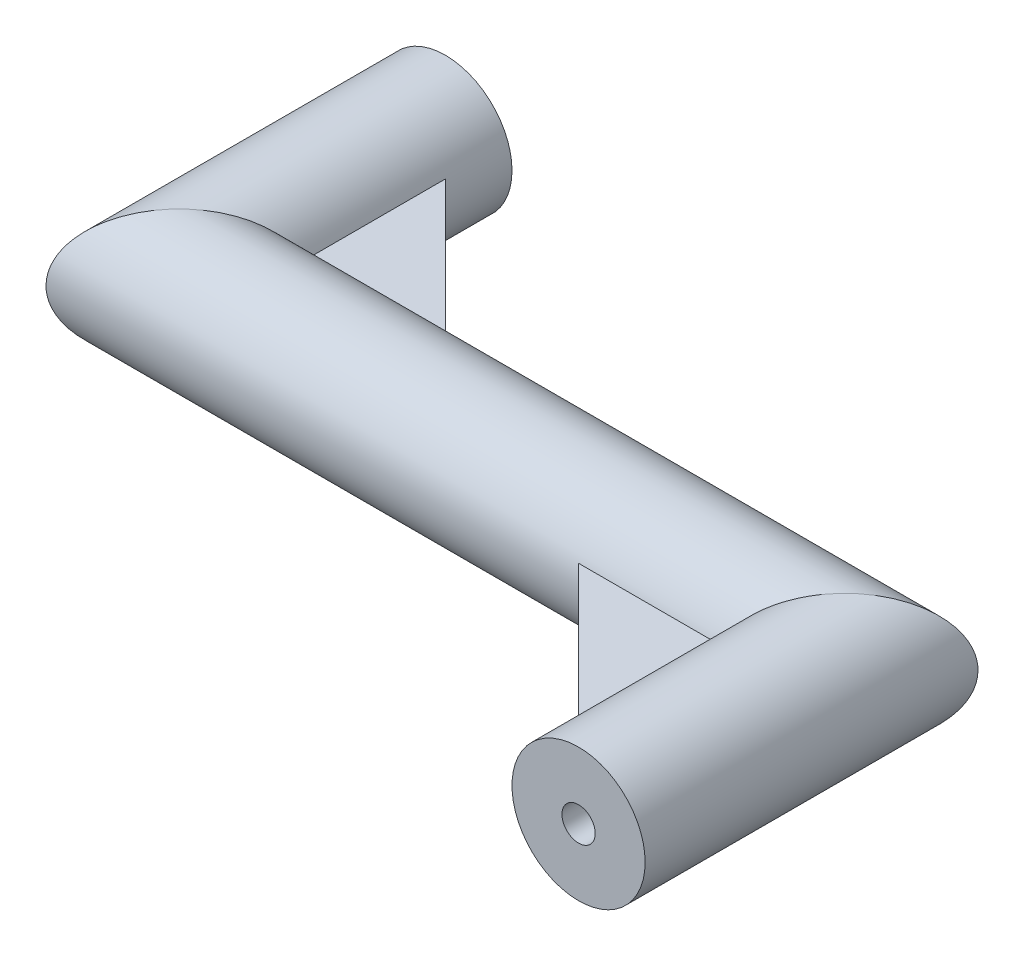
ISO-10303-21;
HEADER;
FILE_DESCRIPTION(('STEP AP214'),'2;1');
FILE_NAME('part.step','',(''),(''),'','','');
FILE_SCHEMA(('AUTOMOTIVE_DESIGN { 1 0 10303 214 1 1 1 1 }'));
ENDSEC;
DATA;
#1=APPLICATION_CONTEXT('core data for automotive mechanical design processes');
#2=APPLICATION_PROTOCOL_DEFINITION('international standard','automotive_design',2000,#1);
#3=PRODUCT_CONTEXT('',#1,'mechanical');
#4=PRODUCT('Part','Part','',(#3));
#5=PRODUCT_RELATED_PRODUCT_CATEGORY('part','',(#4));
#6=PRODUCT_DEFINITION_FORMATION('','',#4);
#7=PRODUCT_DEFINITION_CONTEXT('part definition',#1,'design');
#8=PRODUCT_DEFINITION('design','',#6,#7);
#9=PRODUCT_DEFINITION_SHAPE('','',#8);
#10=(LENGTH_UNIT() NAMED_UNIT(*) SI_UNIT(.MILLI.,.METRE.));
#11=(NAMED_UNIT(*) PLANE_ANGLE_UNIT() SI_UNIT($,.RADIAN.));
#12=(NAMED_UNIT(*) SI_UNIT($,.STERADIAN.) SOLID_ANGLE_UNIT());
#13=UNCERTAINTY_MEASURE_WITH_UNIT(LENGTH_MEASURE(1.E-05),#10,'distance_accuracy_value','');
#14=(GEOMETRIC_REPRESENTATION_CONTEXT(3) GLOBAL_UNCERTAINTY_ASSIGNED_CONTEXT((#13)) GLOBAL_UNIT_ASSIGNED_CONTEXT((#10,
#11,#12)) REPRESENTATION_CONTEXT('',''));
#15=CARTESIAN_POINT('',(0.,0.,0.));
#16=DIRECTION('',(0.,0.,1.));
#17=DIRECTION('',(1.,0.,0.));
#18=AXIS2_PLACEMENT_3D('',#15,#16,#17);
#19=CARTESIAN_POINT('',(-30.,0.,-24.));
#20=DIRECTION('',(0.,0.,1.));
#21=DIRECTION('',(1.,0.,0.));
#22=AXIS2_PLACEMENT_3D('',#19,#20,#21);
#23=PLANE('',#22);
#24=CARTESIAN_POINT('',(-30.,0.,-24.));
#25=DIRECTION('',(0.,0.,-1.));
#26=DIRECTION('',(-1.,0.,0.));
#27=AXIS2_PLACEMENT_3D('',#24,#25,#26);
#28=CIRCLE('',#27,0.750000000000002);
#29=CARTESIAN_POINT('',(-30.75,0.,-24.));
#30=VERTEX_POINT('',#29);
#31=EDGE_CURVE('E206',#30,#30,#28,.T.);
#32=ORIENTED_EDGE('',*,*,#31,.F.);
#33=EDGE_LOOP('',(#32));
#34=FACE_BOUND('',#33,.T.);
#35=CARTESIAN_POINT('',(-30.,0.,-24.));
#36=DIRECTION('',(0.,0.,1.));
#37=DIRECTION('',(1.,0.,0.));
#38=AXIS2_PLACEMENT_3D('',#35,#36,#37);
#39=CIRCLE('',#38,3.);
#40=CARTESIAN_POINT('',(-27.,0.,-24.));
#41=VERTEX_POINT('',#40);
#42=EDGE_CURVE('E139',#41,#41,#39,.T.);
#43=ORIENTED_EDGE('',*,*,#42,.F.);
#44=EDGE_LOOP('',(#43));
#45=FACE_BOUND('',#44,.T.);
#46=ADVANCED_FACE('F35',(#34,#45),#23,.F.);
#47=CARTESIAN_POINT('',(0.,0.,0.));
#48=DIRECTION('',(0.,0.,1.));
#49=DIRECTION('',(1.,0.,0.));
#50=AXIS2_PLACEMENT_3D('',#47,#48,#49);
#51=PLANE('',#50);
#52=CARTESIAN_POINT('',(0.,0.,0.));
#53=DIRECTION('',(0.,0.,1.));
#54=DIRECTION('',(1.,0.,0.));
#55=AXIS2_PLACEMENT_3D('',#52,#53,#54);
#56=CIRCLE('',#55,0.75);
#57=CARTESIAN_POINT('',(0.75,0.,0.));
#58=VERTEX_POINT('',#57);
#59=EDGE_CURVE('E118',#58,#58,#56,.T.);
#60=ORIENTED_EDGE('',*,*,#59,.F.);
#61=EDGE_LOOP('',(#60));
#62=FACE_BOUND('',#61,.T.);
#63=CARTESIAN_POINT('',(0.,0.,0.));
#64=DIRECTION('',(0.,0.,1.));
#65=DIRECTION('',(1.,0.,0.));
#66=AXIS2_PLACEMENT_3D('',#63,#64,#65);
#67=CIRCLE('',#66,3.);
#68=CARTESIAN_POINT('',(3.,0.,0.));
#69=VERTEX_POINT('',#68);
#70=EDGE_CURVE('E140',#69,#69,#67,.T.);
#71=ORIENTED_EDGE('',*,*,#70,.T.);
#72=EDGE_LOOP('',(#71));
#73=FACE_BOUND('',#72,.T.);
#74=ADVANCED_FACE('F193',(#62,#73),#51,.T.);
#75=CARTESIAN_POINT('',(-30.,0.,-8.59999999999999));
#76=DIRECTION('',(0.,0.,-1.));
#77=DIRECTION('',(-1.,0.,0.));
#78=AXIS2_PLACEMENT_3D('',#75,#76,#77);
#79=CYLINDRICAL_SURFACE('',#78,3.);
#80=CARTESIAN_POINT('',(-30.,0.,-12.));
#81=DIRECTION('',(-0.707106781186548,0.,-0.707106781186547));
#82=DIRECTION('',(-0.707106781186547,0.,0.707106781186548));
#83=AXIS2_PLACEMENT_3D('',#80,#81,#82);
#84=ELLIPSE('',#83,4.24264068711929,3.);
#85=CARTESIAN_POINT('',(-33.,0.,-9.));
#86=VERTEX_POINT('',#85);
#87=CARTESIAN_POINT('',(-27.1715728752538,1.,-14.8284271247462));
#88=VERTEX_POINT('',#87);
#89=EDGE_CURVE('E144',#86,#88,#84,.T.);
#90=ORIENTED_EDGE('',*,*,#89,.T.);
#91=DIRECTION('',(0.,0.,-1.));
#92=VECTOR('',#91,1.);
#93=CARTESIAN_POINT('',(-27.1715728752538,1.,-8.59999999999999));
#94=LINE('',#93,#92);
#95=CARTESIAN_POINT('',(-27.1715728752538,1.,-21.1715728752538));
#96=VERTEX_POINT('',#95);
#97=EDGE_CURVE('E135',#88,#96,#94,.T.);
#98=ORIENTED_EDGE('',*,*,#97,.T.);
#99=CARTESIAN_POINT('',(-30.,0.,-24.));
#100=DIRECTION('',(0.707106781186544,0.,-0.707106781186552));
#101=DIRECTION('',(-0.707106781186552,0.,-0.707106781186544));
#102=AXIS2_PLACEMENT_3D('',#99,#100,#101);
#103=ELLIPSE('',#102,4.24264068711926,3.);
#104=CARTESIAN_POINT('',(-27.1715728752538,-1.,-21.1715728752538));
#105=VERTEX_POINT('',#104);
#106=EDGE_CURVE('E137',#96,#105,#103,.T.);
#107=ORIENTED_EDGE('',*,*,#106,.T.);
#108=DIRECTION('',(0.,0.,-1.));
#109=VECTOR('',#108,1.);
#110=CARTESIAN_POINT('',(-27.1715728752538,-1.,-8.59999999999999));
#111=LINE('',#110,#109);
#112=CARTESIAN_POINT('',(-27.1715728752538,-1.,-14.8284271247462));
#113=VERTEX_POINT('',#112);
#114=EDGE_CURVE('E130',#113,#105,#111,.T.);
#115=ORIENTED_EDGE('',*,*,#114,.F.);
#116=EDGE_CURVE('E150',#113,#86,#84,.T.);
#117=ORIENTED_EDGE('',*,*,#116,.T.);
#118=EDGE_LOOP('',(#90,#98,#107,#115,#117));
#119=FACE_BOUND('',#118,.T.);
#120=ORIENTED_EDGE('',*,*,#42,.T.);
#121=EDGE_LOOP('',(#120));
#122=FACE_BOUND('',#121,.T.);
#123=ADVANCED_FACE('F165',(#119,#122),#79,.T.);
#124=CARTESIAN_POINT('',(3.4,0.,-12.));
#125=DIRECTION('',(-1.,0.,0.));
#126=DIRECTION('',(0.,0.,1.));
#127=AXIS2_PLACEMENT_3D('',#124,#125,#126);
#128=CYLINDRICAL_SURFACE('',#127,3.);
#129=CARTESIAN_POINT('',(-12.,0.,-12.));
#130=DIRECTION('',(-0.707106781186549,0.,0.707106781186546));
#131=DIRECTION('',(-0.707106781186546,0.,-0.707106781186549));
#132=AXIS2_PLACEMENT_3D('',#129,#130,#131);
#133=ELLIPSE('',#132,4.24264068711928,3.);
#134=CARTESIAN_POINT('',(-9.17157287525379,-1.,-9.17157287525381));
#135=VERTEX_POINT('',#134);
#136=CARTESIAN_POINT('',(-9.17157287525378,1.,-9.17157287525381));
#137=VERTEX_POINT('',#136);
#138=EDGE_CURVE('E49',#135,#137,#133,.T.);
#139=ORIENTED_EDGE('',*,*,#138,.T.);
#140=DIRECTION('',(-1.,0.,0.));
#141=VECTOR('',#140,1.);
#142=CARTESIAN_POINT('',(3.4,1.,-9.17157287525381));
#143=LINE('',#142,#141);
#144=CARTESIAN_POINT('',(-2.82842712474619,1.,-9.17157287525381));
#145=VERTEX_POINT('',#144);
#146=EDGE_CURVE('E123',#137,#145,#143,.F.);
#147=ORIENTED_EDGE('',*,*,#146,.T.);
#148=CARTESIAN_POINT('',(0.,0.,-12.));
#149=DIRECTION('',(-0.707106781186548,0.,-0.707106781186547));
#150=DIRECTION('',(0.707106781186547,0.,-0.707106781186548));
#151=AXIS2_PLACEMENT_3D('',#148,#149,#150);
#152=ELLIPSE('',#151,4.24264068711929,3.);
#153=CARTESIAN_POINT('',(3.,0.,-15.));
#154=VERTEX_POINT('',#153);
#155=EDGE_CURVE('E143',#145,#154,#152,.T.);
#156=ORIENTED_EDGE('',*,*,#155,.T.);
#157=CARTESIAN_POINT('',(-2.82842712474619,-1.,-9.17157287525381));
#158=VERTEX_POINT('',#157);
#159=EDGE_CURVE('E145',#154,#158,#152,.T.);
#160=ORIENTED_EDGE('',*,*,#159,.T.);
#161=DIRECTION('',(-1.,0.,0.));
#162=VECTOR('',#161,1.);
#163=CARTESIAN_POINT('',(3.4,-1.,-9.17157287525381));
#164=LINE('',#163,#162);
#165=EDGE_CURVE('E54',#135,#158,#164,.F.);
#166=ORIENTED_EDGE('',*,*,#165,.F.);
#167=EDGE_LOOP('',(#139,#147,#156,#160,#166));
#168=FACE_BOUND('',#167,.T.);
#169=CARTESIAN_POINT('',(-17.9999999999999,0.,-12.));
#170=DIRECTION('',(0.707106781186544,0.,-0.707106781186552));
#171=DIRECTION('',(-0.707106781186552,0.,-0.707106781186544));
#172=AXIS2_PLACEMENT_3D('',#169,#170,#171);
#173=ELLIPSE('',#172,4.24264068711931,3.);
#174=CARTESIAN_POINT('',(-20.8284271247461,-1.,-14.8284271247462));
#175=VERTEX_POINT('',#174);
#176=CARTESIAN_POINT('',(-20.8284271247461,1.,-14.8284271247462));
#177=VERTEX_POINT('',#176);
#178=EDGE_CURVE('E154',#175,#177,#173,.T.);
#179=ORIENTED_EDGE('',*,*,#178,.T.);
#180=DIRECTION('',(-1.,0.,0.));
#181=VECTOR('',#180,1.);
#182=CARTESIAN_POINT('',(3.4,1.,-14.8284271247462));
#183=LINE('',#182,#181);
#184=EDGE_CURVE('E110',#177,#88,#183,.T.);
#185=ORIENTED_EDGE('',*,*,#184,.T.);
#186=ORIENTED_EDGE('',*,*,#89,.F.);
#187=ORIENTED_EDGE('',*,*,#116,.F.);
#188=DIRECTION('',(-1.,0.,0.));
#189=VECTOR('',#188,1.);
#190=CARTESIAN_POINT('',(3.4,-1.,-14.8284271247462));
#191=LINE('',#190,#189);
#192=EDGE_CURVE('E147',#175,#113,#191,.T.);
#193=ORIENTED_EDGE('',*,*,#192,.F.);
#194=EDGE_LOOP('',(#179,#185,#186,#187,#193));
#195=FACE_BOUND('',#194,.T.);
#196=ADVANCED_FACE('F159',(#168,#195),#128,.T.);
#197=CARTESIAN_POINT('',(0.,0.,0.));
#198=DIRECTION('',(0.,0.,-1.));
#199=DIRECTION('',(-1.,0.,0.));
#200=AXIS2_PLACEMENT_3D('',#197,#198,#199);
#201=CYLINDRICAL_SURFACE('',#200,3.);
#202=ORIENTED_EDGE('',*,*,#70,.F.);
#203=EDGE_LOOP('',(#202));
#204=FACE_BOUND('',#203,.T.);
#205=ORIENTED_EDGE('',*,*,#155,.F.);
#206=DIRECTION('',(0.,0.,-1.));
#207=VECTOR('',#206,1.);
#208=CARTESIAN_POINT('',(-2.82842712474619,1.,0.));
#209=LINE('',#208,#207);
#210=CARTESIAN_POINT('',(-2.82842712474619,1.,-2.8284271247462));
#211=VERTEX_POINT('',#210);
#212=EDGE_CURVE('E11',#145,#211,#209,.F.);
#213=ORIENTED_EDGE('',*,*,#212,.T.);
#214=CARTESIAN_POINT('',(0.,0.,0.));
#215=DIRECTION('',(-0.707106781186549,0.,0.707106781186546));
#216=DIRECTION('',(-0.707106781186546,0.,-0.707106781186549));
#217=AXIS2_PLACEMENT_3D('',#214,#215,#216);
#218=ELLIPSE('',#217,4.24264068711929,3.);
#219=CARTESIAN_POINT('',(-2.82842712474619,-1.,-2.8284271247462));
#220=VERTEX_POINT('',#219);
#221=EDGE_CURVE('E42',#211,#220,#218,.T.);
#222=ORIENTED_EDGE('',*,*,#221,.T.);
#223=DIRECTION('',(0.,0.,-1.));
#224=VECTOR('',#223,1.);
#225=CARTESIAN_POINT('',(-2.82842712474619,-1.,0.));
#226=LINE('',#225,#224);
#227=EDGE_CURVE('E100',#158,#220,#226,.F.);
#228=ORIENTED_EDGE('',*,*,#227,.F.);
#229=ORIENTED_EDGE('',*,*,#159,.F.);
#230=EDGE_LOOP('',(#205,#213,#222,#228,#229));
#231=FACE_BOUND('',#230,.T.);
#232=ADVANCED_FACE('F98',(#204,#231),#201,.T.);
#233=CARTESIAN_POINT('',(0.,1.,0.));
#234=DIRECTION('',(0.,1.,0.));
#235=DIRECTION('',(0.,0.,1.));
#236=AXIS2_PLACEMENT_3D('',#233,#234,#235);
#237=PLANE('',#236);
#238=ORIENTED_EDGE('',*,*,#97,.F.);
#239=ORIENTED_EDGE('',*,*,#184,.F.);
#240=DIRECTION('',(0.707106781186552,0.,0.707106781186544));
#241=VECTOR('',#240,1.);
#242=CARTESIAN_POINT('',(-2.99999999999983,1.,2.99999999999986));
#243=LINE('',#242,#241);
#244=EDGE_CURVE('E127',#96,#177,#243,.T.);
#245=ORIENTED_EDGE('',*,*,#244,.F.);
#246=EDGE_LOOP('',(#238,#239,#245));
#247=FACE_BOUND('',#246,.T.);
#248=ADVANCED_FACE('F169',(#247),#237,.T.);
#249=CARTESIAN_POINT('',(0.,-1.,0.));
#250=DIRECTION('',(0.,1.,0.));
#251=DIRECTION('',(0.,0.,1.));
#252=AXIS2_PLACEMENT_3D('',#249,#250,#251);
#253=PLANE('',#252);
#254=ORIENTED_EDGE('',*,*,#192,.T.);
#255=ORIENTED_EDGE('',*,*,#114,.T.);
#256=DIRECTION('',(0.707106781186552,0.,0.707106781186544));
#257=VECTOR('',#256,1.);
#258=CARTESIAN_POINT('',(-2.99999999999983,-1.,2.99999999999986));
#259=LINE('',#258,#257);
#260=EDGE_CURVE('E126',#105,#175,#259,.T.);
#261=ORIENTED_EDGE('',*,*,#260,.T.);
#262=EDGE_LOOP('',(#254,#255,#261));
#263=FACE_BOUND('',#262,.T.);
#264=ADVANCED_FACE('F174',(#263),#253,.F.);
#265=CARTESIAN_POINT('',(-2.99999999999983,1.,2.99999999999986));
#266=DIRECTION('',(0.707106781186544,0.,-0.707106781186552));
#267=DIRECTION('',(-0.707106781186552,0.,-0.707106781186544));
#268=AXIS2_PLACEMENT_3D('',#265,#266,#267);
#269=PLANE('',#268);
#270=ORIENTED_EDGE('',*,*,#106,.F.);
#271=ORIENTED_EDGE('',*,*,#244,.T.);
#272=ORIENTED_EDGE('',*,*,#178,.F.);
#273=ORIENTED_EDGE('',*,*,#260,.F.);
#274=EDGE_LOOP('',(#270,#271,#272,#273));
#275=FACE_BOUND('',#274,.T.);
#276=ADVANCED_FACE('F171',(#275),#269,.T.);
#277=CARTESIAN_POINT('',(0.,1.,0.));
#278=DIRECTION('',(0.,1.,0.));
#279=DIRECTION('',(0.,0.,1.));
#280=AXIS2_PLACEMENT_3D('',#277,#278,#279);
#281=PLANE('',#280);
#282=ORIENTED_EDGE('',*,*,#146,.F.);
#283=DIRECTION('',(-0.707106781186546,0.,-0.707106781186549));
#284=VECTOR('',#283,1.);
#285=CARTESIAN_POINT('',(0.,1.,0.));
#286=LINE('',#285,#284);
#287=EDGE_CURVE('E113',#211,#137,#286,.T.);
#288=ORIENTED_EDGE('',*,*,#287,.F.);
#289=ORIENTED_EDGE('',*,*,#212,.F.);
#290=EDGE_LOOP('',(#282,#288,#289));
#291=FACE_BOUND('',#290,.T.);
#292=ADVANCED_FACE('F181',(#291),#281,.T.);
#293=CARTESIAN_POINT('',(0.,-1.,0.));
#294=DIRECTION('',(0.,1.,0.));
#295=DIRECTION('',(0.,0.,1.));
#296=AXIS2_PLACEMENT_3D('',#293,#294,#295);
#297=PLANE('',#296);
#298=DIRECTION('',(-0.707106781186546,0.,-0.707106781186549));
#299=VECTOR('',#298,1.);
#300=CARTESIAN_POINT('',(0.,-1.,0.));
#301=LINE('',#300,#299);
#302=EDGE_CURVE('E109',#220,#135,#301,.T.);
#303=ORIENTED_EDGE('',*,*,#302,.T.);
#304=ORIENTED_EDGE('',*,*,#165,.T.);
#305=ORIENTED_EDGE('',*,*,#227,.T.);
#306=EDGE_LOOP('',(#303,#304,#305));
#307=FACE_BOUND('',#306,.T.);
#308=ADVANCED_FACE('F108',(#307),#297,.F.);
#309=CARTESIAN_POINT('',(0.,1.,0.));
#310=DIRECTION('',(-0.707106781186549,0.,0.707106781186546));
#311=DIRECTION('',(0.707106781186546,0.,0.707106781186549));
#312=AXIS2_PLACEMENT_3D('',#309,#310,#311);
#313=PLANE('',#312);
#314=ORIENTED_EDGE('',*,*,#138,.F.);
#315=ORIENTED_EDGE('',*,*,#302,.F.);
#316=ORIENTED_EDGE('',*,*,#221,.F.);
#317=ORIENTED_EDGE('',*,*,#287,.T.);
#318=EDGE_LOOP('',(#314,#315,#316,#317));
#319=FACE_BOUND('',#318,.T.);
#320=ADVANCED_FACE('F112',(#319),#313,.T.);
#321=CARTESIAN_POINT('',(0.,0.,-10.));
#322=DIRECTION('',(0.,0.,1.));
#323=DIRECTION('',(1.,0.,0.));
#324=AXIS2_PLACEMENT_3D('',#321,#322,#323);
#325=CYLINDRICAL_SURFACE('',#324,0.75);
#326=CARTESIAN_POINT('',(0.,0.,-10.));
#327=DIRECTION('',(0.,0.,1.));
#328=DIRECTION('',(1.,0.,0.));
#329=AXIS2_PLACEMENT_3D('',#326,#327,#328);
#330=CIRCLE('',#329,0.75);
#331=CARTESIAN_POINT('',(0.75,0.,-10.));
#332=VERTEX_POINT('',#331);
#333=EDGE_CURVE('E114',#332,#332,#330,.T.);
#334=ORIENTED_EDGE('',*,*,#333,.F.);
#335=EDGE_LOOP('',(#334));
#336=FACE_BOUND('',#335,.T.);
#337=ORIENTED_EDGE('',*,*,#59,.T.);
#338=EDGE_LOOP('',(#337));
#339=FACE_BOUND('',#338,.T.);
#340=ADVANCED_FACE('F226',(#336,#339),#325,.F.);
#341=CARTESIAN_POINT('',(0.,0.,-10.));
#342=DIRECTION('',(0.,0.,1.));
#343=DIRECTION('',(1.,0.,0.));
#344=AXIS2_PLACEMENT_3D('',#341,#342,#343);
#345=PLANE('',#344);
#346=ORIENTED_EDGE('',*,*,#333,.T.);
#347=EDGE_LOOP('',(#346));
#348=FACE_BOUND('',#347,.T.);
#349=ADVANCED_FACE('F217',(#348),#345,.T.);
#350=CARTESIAN_POINT('',(-30.,0.,-14.));
#351=DIRECTION('',(0.,0.,-1.));
#352=DIRECTION('',(-1.,0.,0.));
#353=AXIS2_PLACEMENT_3D('',#350,#351,#352);
#354=CYLINDRICAL_SURFACE('',#353,0.750000000000002);
#355=CARTESIAN_POINT('',(-30.,0.,-14.));
#356=DIRECTION('',(0.,0.,-1.));
#357=DIRECTION('',(-1.,0.,0.));
#358=AXIS2_PLACEMENT_3D('',#355,#356,#357);
#359=CIRCLE('',#358,0.750000000000002);
#360=CARTESIAN_POINT('',(-30.75,0.,-14.));
#361=VERTEX_POINT('',#360);
#362=EDGE_CURVE('E204',#361,#361,#359,.T.);
#363=ORIENTED_EDGE('',*,*,#362,.F.);
#364=EDGE_LOOP('',(#363));
#365=FACE_BOUND('',#364,.T.);
#366=ORIENTED_EDGE('',*,*,#31,.T.);
#367=EDGE_LOOP('',(#366));
#368=FACE_BOUND('',#367,.T.);
#369=ADVANCED_FACE('F212',(#365,#368),#354,.F.);
#370=CARTESIAN_POINT('',(-30.,0.,-14.));
#371=DIRECTION('',(0.,0.,-1.));
#372=DIRECTION('',(-1.,0.,0.));
#373=AXIS2_PLACEMENT_3D('',#370,#371,#372);
#374=PLANE('',#373);
#375=ORIENTED_EDGE('',*,*,#362,.T.);
#376=EDGE_LOOP('',(#375));
#377=FACE_BOUND('',#376,.T.);
#378=ADVANCED_FACE('F216',(#377),#374,.T.);
#379=CLOSED_SHELL('',(#46,#74,#123,#196,#232,#248,#264,#276,#292,#308,#320,#340,#349,#369,#378));
#380=MANIFOLD_SOLID_BREP('B2',#379);
#381=ADVANCED_BREP_SHAPE_REPRESENTATION('',(#18,#380),#14);
#382=SHAPE_DEFINITION_REPRESENTATION(#9,#381);
ENDSEC;
END-ISO-10303-21;
